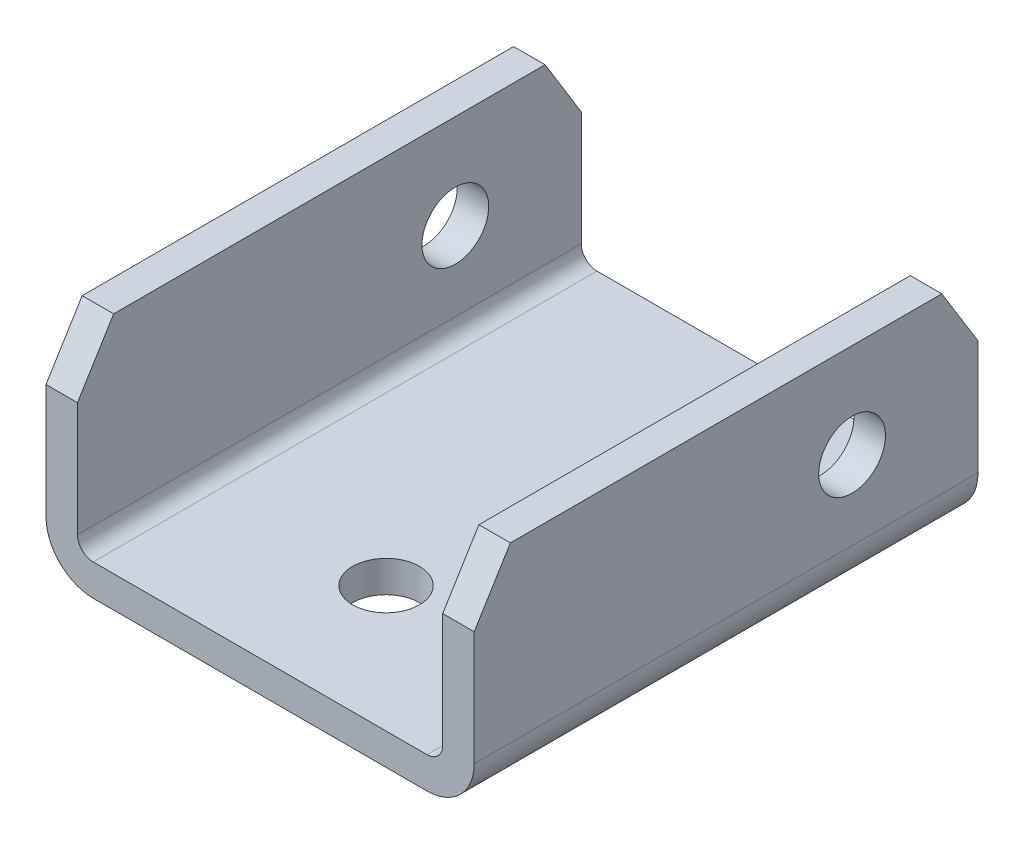
ISO-10303-21;
HEADER;
FILE_DESCRIPTION(('STEP AP214'),'2;1');
FILE_NAME('part.step','',(''),(''),'','','');
FILE_SCHEMA(('AUTOMOTIVE_DESIGN { 1 0 10303 214 1 1 1 1 }'));
ENDSEC;
DATA;
#1=APPLICATION_CONTEXT('core data for automotive mechanical design processes');
#2=APPLICATION_PROTOCOL_DEFINITION('international standard','automotive_design',2000,#1);
#3=PRODUCT_CONTEXT('',#1,'mechanical');
#4=PRODUCT('Part','Part','',(#3));
#5=PRODUCT_RELATED_PRODUCT_CATEGORY('part','',(#4));
#6=PRODUCT_DEFINITION_FORMATION('','',#4);
#7=PRODUCT_DEFINITION_CONTEXT('part definition',#1,'design');
#8=PRODUCT_DEFINITION('design','',#6,#7);
#9=PRODUCT_DEFINITION_SHAPE('','',#8);
#10=(LENGTH_UNIT() NAMED_UNIT(*) SI_UNIT(.MILLI.,.METRE.));
#11=(NAMED_UNIT(*) PLANE_ANGLE_UNIT() SI_UNIT($,.RADIAN.));
#12=(NAMED_UNIT(*) SI_UNIT($,.STERADIAN.) SOLID_ANGLE_UNIT());
#13=UNCERTAINTY_MEASURE_WITH_UNIT(LENGTH_MEASURE(1.E-05),#10,'distance_accuracy_value','');
#14=(GEOMETRIC_REPRESENTATION_CONTEXT(3) GLOBAL_UNCERTAINTY_ASSIGNED_CONTEXT((#13)) GLOBAL_UNIT_ASSIGNED_CONTEXT((#10,
#11,#12)) REPRESENTATION_CONTEXT('',''));
#15=CARTESIAN_POINT('',(0.,0.,0.));
#16=DIRECTION('',(0.,0.,1.));
#17=DIRECTION('',(1.,0.,0.));
#18=AXIS2_PLACEMENT_3D('',#15,#16,#17);
#19=CARTESIAN_POINT('',(-18.415,0.,25.4));
#20=DIRECTION('',(-1.,0.,0.));
#21=DIRECTION('',(0.,0.,1.));
#22=AXIS2_PLACEMENT_3D('',#19,#20,#21);
#23=PLANE('',#22);
#24=DIRECTION('',(0.,-0.851962880519693,-0.523602186986062));
#25=VECTOR('',#24,1.);
#26=CARTESIAN_POINT('',(-18.415,23.6457625813702,-13.0744611493481));
#27=LINE('',#26,#25);
#28=CARTESIAN_POINT('',(-18.415,3.59064851929258,-25.4));
#29=VERTEX_POINT('',#28);
#30=CARTESIAN_POINT('',(-18.415,9.525,-21.7528464858152));
#31=VERTEX_POINT('',#30);
#32=EDGE_CURVE('E244',#29,#31,#27,.F.);
#33=ORIENTED_EDGE('',*,*,#32,.T.);
#34=DIRECTION('',(0.,0.,1.));
#35=VECTOR('',#34,1.);
#36=CARTESIAN_POINT('',(-18.415,9.525,25.4));
#37=LINE('',#36,#35);
#38=CARTESIAN_POINT('',(-18.415,9.525,21.7528464858152));
#39=VERTEX_POINT('',#38);
#40=EDGE_CURVE('E246',#39,#31,#37,.F.);
#41=ORIENTED_EDGE('',*,*,#40,.F.);
#42=DIRECTION('',(0.,-0.851962880519693,0.523602186986062));
#43=VECTOR('',#42,1.);
#44=CARTESIAN_POINT('',(-18.415,0.984409505840551,27.0017510603507));
#45=LINE('',#44,#43);
#46=CARTESIAN_POINT('',(-18.415,3.59064851929258,25.4));
#47=VERTEX_POINT('',#46);
#48=EDGE_CURVE('E127',#47,#39,#45,.F.);
#49=ORIENTED_EDGE('',*,*,#48,.F.);
#50=DIRECTION('',(0.,1.,0.));
#51=VECTOR('',#50,1.);
#52=CARTESIAN_POINT('',(-18.415,0.,25.4));
#53=LINE('',#52,#51);
#54=CARTESIAN_POINT('',(-18.415,-7.9375,25.4));
#55=VERTEX_POINT('',#54);
#56=EDGE_CURVE('E86',#55,#47,#53,.T.);
#57=ORIENTED_EDGE('',*,*,#56,.F.);
#58=DIRECTION('',(0.,0.,1.));
#59=VECTOR('',#58,1.);
#60=CARTESIAN_POINT('',(-18.415,-7.9375,25.4));
#61=LINE('',#60,#59);
#62=CARTESIAN_POINT('',(-18.415,-7.9375,-25.4));
#63=VERTEX_POINT('',#62);
#64=EDGE_CURVE('E187',#55,#63,#61,.F.);
#65=ORIENTED_EDGE('',*,*,#64,.T.);
#66=DIRECTION('',(0.,1.,0.));
#67=VECTOR('',#66,1.);
#68=CARTESIAN_POINT('',(-18.415,0.,-25.4));
#69=LINE('',#68,#67);
#70=EDGE_CURVE('E197',#63,#29,#69,.T.);
#71=ORIENTED_EDGE('',*,*,#70,.T.);
#72=EDGE_LOOP('',(#33,#41,#49,#57,#65,#71));
#73=FACE_BOUND('',#72,.T.);
#74=CARTESIAN_POINT('',(-18.415,0.,-12.7));
#75=DIRECTION('',(-1.,0.,0.));
#76=DIRECTION('',(0.,0.,1.));
#77=AXIS2_PLACEMENT_3D('',#74,#75,#76);
#78=CIRCLE('',#77,3.3655);
#79=CARTESIAN_POINT('',(-18.415,0.,-9.3345));
#80=VERTEX_POINT('',#79);
#81=EDGE_CURVE('E20',#80,#80,#78,.T.);
#82=ORIENTED_EDGE('',*,*,#81,.T.);
#83=EDGE_LOOP('',(#82));
#84=FACE_BOUND('',#83,.T.);
#85=ADVANCED_FACE('F17',(#73,#84),#23,.F.);
#86=CARTESIAN_POINT('',(18.415,0.,25.4));
#87=DIRECTION('',(-1.,0.,0.));
#88=DIRECTION('',(0.,0.,1.));
#89=AXIS2_PLACEMENT_3D('',#86,#87,#88);
#90=PLANE('',#89);
#91=CARTESIAN_POINT('',(18.415,0.,-12.7));
#92=DIRECTION('',(-1.,0.,0.));
#93=DIRECTION('',(0.,0.,1.));
#94=AXIS2_PLACEMENT_3D('',#91,#92,#93);
#95=CIRCLE('',#94,3.3655);
#96=CARTESIAN_POINT('',(18.415,0.,-9.3345));
#97=VERTEX_POINT('',#96);
#98=EDGE_CURVE('E224',#97,#97,#95,.F.);
#99=ORIENTED_EDGE('',*,*,#98,.T.);
#100=EDGE_LOOP('',(#99));
#101=FACE_BOUND('',#100,.T.);
#102=DIRECTION('',(0.,-0.851962880519693,0.523602186986062));
#103=VECTOR('',#102,1.);
#104=CARTESIAN_POINT('',(18.415,0.984409505840551,27.0017510603507));
#105=LINE('',#104,#103);
#106=CARTESIAN_POINT('',(18.415,9.52499999999999,21.7528464858152));
#107=VERTEX_POINT('',#106);
#108=CARTESIAN_POINT('',(18.415,3.59064851929258,25.4));
#109=VERTEX_POINT('',#108);
#110=EDGE_CURVE('E161',#107,#109,#105,.T.);
#111=ORIENTED_EDGE('',*,*,#110,.F.);
#112=DIRECTION('',(0.,0.,1.));
#113=VECTOR('',#112,1.);
#114=CARTESIAN_POINT('',(18.415,9.525,25.4));
#115=LINE('',#114,#113);
#116=CARTESIAN_POINT('',(18.415,9.525,-21.7528464858152));
#117=VERTEX_POINT('',#116);
#118=EDGE_CURVE('E219',#117,#107,#115,.T.);
#119=ORIENTED_EDGE('',*,*,#118,.F.);
#120=DIRECTION('',(0.,-0.851962880519693,-0.523602186986062));
#121=VECTOR('',#120,1.);
#122=CARTESIAN_POINT('',(18.415,23.6457625813702,-13.0744611493481));
#123=LINE('',#122,#121);
#124=CARTESIAN_POINT('',(18.415,3.59064851929258,-25.4));
#125=VERTEX_POINT('',#124);
#126=EDGE_CURVE('E97',#117,#125,#123,.T.);
#127=ORIENTED_EDGE('',*,*,#126,.T.);
#128=DIRECTION('',(0.,1.,0.));
#129=VECTOR('',#128,1.);
#130=CARTESIAN_POINT('',(18.415,0.,-25.4));
#131=LINE('',#130,#129);
#132=CARTESIAN_POINT('',(18.415,-7.9375,-25.4));
#133=VERTEX_POINT('',#132);
#134=EDGE_CURVE('E186',#125,#133,#131,.F.);
#135=ORIENTED_EDGE('',*,*,#134,.T.);
#136=DIRECTION('',(0.,0.,-1.));
#137=VECTOR('',#136,1.);
#138=CARTESIAN_POINT('',(18.415,-7.9375,25.4));
#139=LINE('',#138,#137);
#140=CARTESIAN_POINT('',(18.415,-7.9375,25.4));
#141=VERTEX_POINT('',#140);
#142=EDGE_CURVE('E184',#133,#141,#139,.F.);
#143=ORIENTED_EDGE('',*,*,#142,.T.);
#144=DIRECTION('',(0.,1.,0.));
#145=VECTOR('',#144,1.);
#146=CARTESIAN_POINT('',(18.415,0.,25.4));
#147=LINE('',#146,#145);
#148=EDGE_CURVE('E162',#109,#141,#147,.F.);
#149=ORIENTED_EDGE('',*,*,#148,.F.);
#150=EDGE_LOOP('',(#111,#119,#127,#135,#143,#149));
#151=FACE_BOUND('',#150,.T.);
#152=ADVANCED_FACE('F301',(#101,#151),#90,.T.);
#153=CARTESIAN_POINT('',(-18.415,0.,-12.7));
#154=DIRECTION('',(-1.,0.,0.));
#155=DIRECTION('',(0.,0.,1.));
#156=AXIS2_PLACEMENT_3D('',#153,#154,#155);
#157=CYLINDRICAL_SURFACE('',#156,3.3655);
#158=CARTESIAN_POINT('',(-21.59,0.,-12.7));
#159=DIRECTION('',(-1.,0.,0.));
#160=DIRECTION('',(0.,0.,1.));
#161=AXIS2_PLACEMENT_3D('',#158,#159,#160);
#162=CIRCLE('',#161,3.3655);
#163=CARTESIAN_POINT('',(-21.59,0.,-9.3345));
#164=VERTEX_POINT('',#163);
#165=EDGE_CURVE('E146',#164,#164,#162,.F.);
#166=ORIENTED_EDGE('',*,*,#165,.F.);
#167=EDGE_LOOP('',(#166));
#168=FACE_BOUND('',#167,.T.);
#169=ORIENTED_EDGE('',*,*,#81,.F.);
#170=EDGE_LOOP('',(#169));
#171=FACE_BOUND('',#170,.T.);
#172=ADVANCED_FACE('F434',(#168,#171),#157,.F.);
#173=CARTESIAN_POINT('',(-18.415,0.984409505840551,27.0017510603507));
#174=DIRECTION('',(0.,0.523602186986062,0.851962880519693));
#175=DIRECTION('',(0.,-0.851962880519693,0.523602186986062));
#176=AXIS2_PLACEMENT_3D('',#173,#174,#175);
#177=PLANE('',#176);
#178=DIRECTION('',(1.,0.,0.));
#179=VECTOR('',#178,1.);
#180=CARTESIAN_POINT('',(-18.415,3.59064851929258,25.4));
#181=LINE('',#180,#179);
#182=CARTESIAN_POINT('',(-21.59,3.59064851929258,25.4));
#183=VERTEX_POINT('',#182);
#184=EDGE_CURVE('E119',#183,#47,#181,.T.);
#185=ORIENTED_EDGE('',*,*,#184,.T.);
#186=ORIENTED_EDGE('',*,*,#48,.T.);
#187=DIRECTION('',(1.,0.,0.));
#188=VECTOR('',#187,1.);
#189=CARTESIAN_POINT('',(-18.415,9.525,21.7528464858152));
#190=LINE('',#189,#188);
#191=CARTESIAN_POINT('',(-21.59,9.525,21.7528464858152));
#192=VERTEX_POINT('',#191);
#193=EDGE_CURVE('E133',#192,#39,#190,.T.);
#194=ORIENTED_EDGE('',*,*,#193,.F.);
#195=DIRECTION('',(0.,0.851962880519693,-0.523602186986062));
#196=VECTOR('',#195,1.);
#197=CARTESIAN_POINT('',(-21.59,3.59064851929258,25.4));
#198=LINE('',#197,#196);
#199=EDGE_CURVE('E130',#183,#192,#198,.T.);
#200=ORIENTED_EDGE('',*,*,#199,.F.);
#201=EDGE_LOOP('',(#185,#186,#194,#200));
#202=FACE_BOUND('',#201,.T.);
#203=ADVANCED_FACE('F131',(#202),#177,.T.);
#204=CARTESIAN_POINT('',(-18.415,9.525,25.4));
#205=DIRECTION('',(0.,1.,0.));
#206=DIRECTION('',(0.,0.,1.));
#207=AXIS2_PLACEMENT_3D('',#204,#205,#206);
#208=PLANE('',#207);
#209=ORIENTED_EDGE('',*,*,#193,.T.);
#210=ORIENTED_EDGE('',*,*,#40,.T.);
#211=DIRECTION('',(1.,0.,0.));
#212=VECTOR('',#211,1.);
#213=CARTESIAN_POINT('',(-18.415,9.525,-21.7528464858152));
#214=LINE('',#213,#212);
#215=CARTESIAN_POINT('',(-21.59,9.525,-21.7528464858152));
#216=VERTEX_POINT('',#215);
#217=EDGE_CURVE('E199',#31,#216,#214,.F.);
#218=ORIENTED_EDGE('',*,*,#217,.T.);
#219=DIRECTION('',(0.,0.,1.));
#220=VECTOR('',#219,1.);
#221=CARTESIAN_POINT('',(-21.59,9.525,25.4));
#222=LINE('',#221,#220);
#223=EDGE_CURVE('E137',#192,#216,#222,.F.);
#224=ORIENTED_EDGE('',*,*,#223,.F.);
#225=EDGE_LOOP('',(#209,#210,#218,#224));
#226=FACE_BOUND('',#225,.T.);
#227=ADVANCED_FACE('F427',(#226),#208,.T.);
#228=CARTESIAN_POINT('',(-18.415,23.6457625813702,-13.0744611493481));
#229=DIRECTION('',(0.,-0.523602186986062,0.851962880519693));
#230=DIRECTION('',(0.,-0.851962880519693,-0.523602186986062));
#231=AXIS2_PLACEMENT_3D('',#228,#229,#230);
#232=PLANE('',#231);
#233=DIRECTION('',(0.,-0.851962880519693,-0.523602186986062));
#234=VECTOR('',#233,1.);
#235=CARTESIAN_POINT('',(-21.59,9.525,-21.7528464858152));
#236=LINE('',#235,#234);
#237=CARTESIAN_POINT('',(-21.59,3.59064851929259,-25.4));
#238=VERTEX_POINT('',#237);
#239=EDGE_CURVE('E209',#216,#238,#236,.T.);
#240=ORIENTED_EDGE('',*,*,#239,.F.);
#241=ORIENTED_EDGE('',*,*,#217,.F.);
#242=ORIENTED_EDGE('',*,*,#32,.F.);
#243=DIRECTION('',(1.,0.,0.));
#244=VECTOR('',#243,1.);
#245=CARTESIAN_POINT('',(-18.415,3.59064851929258,-25.4));
#246=LINE('',#245,#244);
#247=EDGE_CURVE('E196',#29,#238,#246,.F.);
#248=ORIENTED_EDGE('',*,*,#247,.T.);
#249=EDGE_LOOP('',(#240,#241,#242,#248));
#250=FACE_BOUND('',#249,.T.);
#251=ADVANCED_FACE('F420',(#250),#232,.F.);
#252=CARTESIAN_POINT('',(-16.8275,-7.9375,25.4));
#253=DIRECTION('',(0.,0.,1.));
#254=DIRECTION('',(1.,0.,0.));
#255=AXIS2_PLACEMENT_3D('',#252,#253,#254);
#256=CYLINDRICAL_SURFACE('',#255,1.5875);
#257=DIRECTION('',(0.,0.,1.));
#258=VECTOR('',#257,1.);
#259=CARTESIAN_POINT('',(-16.8275,-9.525,25.4));
#260=LINE('',#259,#258);
#261=CARTESIAN_POINT('',(-16.8275,-9.525,25.4));
#262=VERTEX_POINT('',#261);
#263=CARTESIAN_POINT('',(-16.8275,-9.525,-25.4));
#264=VERTEX_POINT('',#263);
#265=EDGE_CURVE('E212',#262,#264,#260,.F.);
#266=ORIENTED_EDGE('',*,*,#265,.T.);
#267=CARTESIAN_POINT('',(-16.8275,-7.9375,-25.4));
#268=DIRECTION('',(0.,0.,1.));
#269=DIRECTION('',(1.,0.,0.));
#270=AXIS2_PLACEMENT_3D('',#267,#268,#269);
#271=CIRCLE('',#270,1.5875);
#272=EDGE_CURVE('E290',#63,#264,#271,.T.);
#273=ORIENTED_EDGE('',*,*,#272,.F.);
#274=ORIENTED_EDGE('',*,*,#64,.F.);
#275=CARTESIAN_POINT('',(-16.8275,-7.9375,25.4));
#276=DIRECTION('',(0.,0.,1.));
#277=DIRECTION('',(1.,0.,0.));
#278=AXIS2_PLACEMENT_3D('',#275,#276,#277);
#279=CIRCLE('',#278,1.5875);
#280=EDGE_CURVE('E296',#55,#262,#279,.T.);
#281=ORIENTED_EDGE('',*,*,#280,.T.);
#282=EDGE_LOOP('',(#266,#273,#274,#281));
#283=FACE_BOUND('',#282,.T.);
#284=ADVANCED_FACE('F413',(#283),#256,.F.);
#285=CARTESIAN_POINT('',(16.8275,-7.9375,25.4));
#286=DIRECTION('',(0.,0.,-1.));
#287=DIRECTION('',(-1.,0.,0.));
#288=AXIS2_PLACEMENT_3D('',#285,#286,#287);
#289=CYLINDRICAL_SURFACE('',#288,1.5875);
#290=ORIENTED_EDGE('',*,*,#142,.F.);
#291=CARTESIAN_POINT('',(16.8275,-7.9375,-25.4));
#292=DIRECTION('',(0.,0.,-1.));
#293=DIRECTION('',(-1.,0.,0.));
#294=AXIS2_PLACEMENT_3D('',#291,#292,#293);
#295=CIRCLE('',#294,1.5875);
#296=CARTESIAN_POINT('',(16.8275,-9.525,-25.4));
#297=VERTEX_POINT('',#296);
#298=EDGE_CURVE('E283',#297,#133,#295,.F.);
#299=ORIENTED_EDGE('',*,*,#298,.F.);
#300=DIRECTION('',(0.,0.,1.));
#301=VECTOR('',#300,1.);
#302=CARTESIAN_POINT('',(16.8275,-9.525,25.4));
#303=LINE('',#302,#301);
#304=CARTESIAN_POINT('',(16.8275,-9.525,25.4));
#305=VERTEX_POINT('',#304);
#306=EDGE_CURVE('E293',#297,#305,#303,.T.);
#307=ORIENTED_EDGE('',*,*,#306,.T.);
#308=CARTESIAN_POINT('',(16.8275,-7.9375,25.4));
#309=DIRECTION('',(0.,0.,-1.));
#310=DIRECTION('',(-1.,0.,0.));
#311=AXIS2_PLACEMENT_3D('',#308,#309,#310);
#312=CIRCLE('',#311,1.5875);
#313=EDGE_CURVE('E287',#305,#141,#312,.F.);
#314=ORIENTED_EDGE('',*,*,#313,.T.);
#315=EDGE_LOOP('',(#290,#299,#307,#314));
#316=FACE_BOUND('',#315,.T.);
#317=ADVANCED_FACE('F411',(#316),#289,.F.);
#318=CARTESIAN_POINT('',(18.415,0.984409505840551,27.0017510603507));
#319=DIRECTION('',(0.,0.523602186986062,0.851962880519693));
#320=DIRECTION('',(0.,-0.851962880519693,0.523602186986062));
#321=AXIS2_PLACEMENT_3D('',#318,#319,#320);
#322=PLANE('',#321);
#323=DIRECTION('',(1.,0.,0.));
#324=VECTOR('',#323,1.);
#325=CARTESIAN_POINT('',(18.415,9.525,21.7528464858152));
#326=LINE('',#325,#324);
#327=CARTESIAN_POINT('',(21.59,9.52499999999999,21.7528464858152));
#328=VERTEX_POINT('',#327);
#329=EDGE_CURVE('E229',#107,#328,#326,.T.);
#330=ORIENTED_EDGE('',*,*,#329,.F.);
#331=ORIENTED_EDGE('',*,*,#110,.T.);
#332=DIRECTION('',(1.,0.,0.));
#333=VECTOR('',#332,1.);
#334=CARTESIAN_POINT('',(18.415,3.59064851929258,25.4));
#335=LINE('',#334,#333);
#336=CARTESIAN_POINT('',(21.59,3.59064851929258,25.4));
#337=VERTEX_POINT('',#336);
#338=EDGE_CURVE('E158',#109,#337,#335,.T.);
#339=ORIENTED_EDGE('',*,*,#338,.T.);
#340=DIRECTION('',(0.,0.851962880519693,-0.523602186986062));
#341=VECTOR('',#340,1.);
#342=CARTESIAN_POINT('',(21.59,3.59064851929258,25.4));
#343=LINE('',#342,#341);
#344=EDGE_CURVE('E165',#337,#328,#343,.T.);
#345=ORIENTED_EDGE('',*,*,#344,.T.);
#346=EDGE_LOOP('',(#330,#331,#339,#345));
#347=FACE_BOUND('',#346,.T.);
#348=ADVANCED_FACE('F395',(#347),#322,.T.);
#349=CARTESIAN_POINT('',(18.415,9.525,25.4));
#350=DIRECTION('',(0.,1.,0.));
#351=DIRECTION('',(0.,0.,1.));
#352=AXIS2_PLACEMENT_3D('',#349,#350,#351);
#353=PLANE('',#352);
#354=DIRECTION('',(1.,0.,0.));
#355=VECTOR('',#354,1.);
#356=CARTESIAN_POINT('',(18.415,9.525,-21.7528464858152));
#357=LINE('',#356,#355);
#358=CARTESIAN_POINT('',(21.59,9.525,-21.7528464858152));
#359=VERTEX_POINT('',#358);
#360=EDGE_CURVE('E181',#359,#117,#357,.F.);
#361=ORIENTED_EDGE('',*,*,#360,.T.);
#362=ORIENTED_EDGE('',*,*,#118,.T.);
#363=ORIENTED_EDGE('',*,*,#329,.T.);
#364=DIRECTION('',(0.,0.,1.));
#365=VECTOR('',#364,1.);
#366=CARTESIAN_POINT('',(21.59,9.525,25.4));
#367=LINE('',#366,#365);
#368=EDGE_CURVE('E168',#328,#359,#367,.F.);
#369=ORIENTED_EDGE('',*,*,#368,.T.);
#370=EDGE_LOOP('',(#361,#362,#363,#369));
#371=FACE_BOUND('',#370,.T.);
#372=ADVANCED_FACE('F315',(#371),#353,.T.);
#373=CARTESIAN_POINT('',(18.415,23.6457625813702,-13.0744611493481));
#374=DIRECTION('',(0.,-0.523602186986062,0.851962880519693));
#375=DIRECTION('',(0.,-0.851962880519693,-0.523602186986062));
#376=AXIS2_PLACEMENT_3D('',#373,#374,#375);
#377=PLANE('',#376);
#378=DIRECTION('',(0.,-0.851962880519693,-0.523602186986062));
#379=VECTOR('',#378,1.);
#380=CARTESIAN_POINT('',(21.59,9.525,-21.7528464858152));
#381=LINE('',#380,#379);
#382=CARTESIAN_POINT('',(21.59,3.59064851929259,-25.4));
#383=VERTEX_POINT('',#382);
#384=EDGE_CURVE('E172',#359,#383,#381,.T.);
#385=ORIENTED_EDGE('',*,*,#384,.T.);
#386=DIRECTION('',(1.,0.,0.));
#387=VECTOR('',#386,1.);
#388=CARTESIAN_POINT('',(18.415,3.59064851929258,-25.4));
#389=LINE('',#388,#387);
#390=EDGE_CURVE('E178',#125,#383,#389,.T.);
#391=ORIENTED_EDGE('',*,*,#390,.F.);
#392=ORIENTED_EDGE('',*,*,#126,.F.);
#393=ORIENTED_EDGE('',*,*,#360,.F.);
#394=EDGE_LOOP('',(#385,#391,#392,#393));
#395=FACE_BOUND('',#394,.T.);
#396=ADVANCED_FACE('F305',(#395),#377,.F.);
#397=CARTESIAN_POINT('',(18.415,0.,-12.7));
#398=DIRECTION('',(-1.,0.,0.));
#399=DIRECTION('',(0.,0.,1.));
#400=AXIS2_PLACEMENT_3D('',#397,#398,#399);
#401=CYLINDRICAL_SURFACE('',#400,3.3655);
#402=CARTESIAN_POINT('',(21.59,0.,-12.7));
#403=DIRECTION('',(-1.,0.,0.));
#404=DIRECTION('',(0.,0.,1.));
#405=AXIS2_PLACEMENT_3D('',#402,#403,#404);
#406=CIRCLE('',#405,3.3655);
#407=CARTESIAN_POINT('',(21.59,0.,-9.3345));
#408=VERTEX_POINT('',#407);
#409=EDGE_CURVE('E175',#408,#408,#406,.F.);
#410=ORIENTED_EDGE('',*,*,#409,.T.);
#411=EDGE_LOOP('',(#410));
#412=FACE_BOUND('',#411,.T.);
#413=ORIENTED_EDGE('',*,*,#98,.F.);
#414=EDGE_LOOP('',(#413));
#415=FACE_BOUND('',#414,.T.);
#416=ADVANCED_FACE('F303',(#412,#415),#401,.F.);
#417=CARTESIAN_POINT('',(-21.59,0.,25.4));
#418=DIRECTION('',(-1.,0.,0.));
#419=DIRECTION('',(0.,0.,1.));
#420=AXIS2_PLACEMENT_3D('',#417,#418,#419);
#421=PLANE('',#420);
#422=ORIENTED_EDGE('',*,*,#223,.T.);
#423=ORIENTED_EDGE('',*,*,#239,.T.);
#424=DIRECTION('',(0.,1.,0.));
#425=VECTOR('',#424,1.);
#426=CARTESIAN_POINT('',(-21.59,0.,-25.4));
#427=LINE('',#426,#425);
#428=CARTESIAN_POINT('',(-21.59,-7.9375,-25.4));
#429=VERTEX_POINT('',#428);
#430=EDGE_CURVE('E144',#238,#429,#427,.F.);
#431=ORIENTED_EDGE('',*,*,#430,.T.);
#432=DIRECTION('',(0.,0.,1.));
#433=VECTOR('',#432,1.);
#434=CARTESIAN_POINT('',(-21.59,-7.9375,25.4));
#435=LINE('',#434,#433);
#436=CARTESIAN_POINT('',(-21.59,-7.9375,25.4));
#437=VERTEX_POINT('',#436);
#438=EDGE_CURVE('E142',#437,#429,#435,.F.);
#439=ORIENTED_EDGE('',*,*,#438,.F.);
#440=DIRECTION('',(0.,1.,0.));
#441=VECTOR('',#440,1.);
#442=CARTESIAN_POINT('',(-21.59,0.,25.4));
#443=LINE('',#442,#441);
#444=EDGE_CURVE('E123',#437,#183,#443,.T.);
#445=ORIENTED_EDGE('',*,*,#444,.T.);
#446=ORIENTED_EDGE('',*,*,#199,.T.);
#447=EDGE_LOOP('',(#422,#423,#431,#439,#445,#446));
#448=FACE_BOUND('',#447,.T.);
#449=ORIENTED_EDGE('',*,*,#165,.T.);
#450=EDGE_LOOP('',(#449));
#451=FACE_BOUND('',#450,.T.);
#452=ADVANCED_FACE('F139',(#448,#451),#421,.T.);
#453=CARTESIAN_POINT('',(0.,-9.525,25.4));
#454=DIRECTION('',(0.,-1.,0.));
#455=DIRECTION('',(1.,0.,0.));
#456=AXIS2_PLACEMENT_3D('',#453,#454,#455);
#457=PLANE('',#456);
#458=ORIENTED_EDGE('',*,*,#306,.F.);
#459=DIRECTION('',(1.,0.,0.));
#460=VECTOR('',#459,1.);
#461=CARTESIAN_POINT('',(0.,-9.525,-25.4));
#462=LINE('',#461,#460);
#463=EDGE_CURVE('E275',#297,#264,#462,.F.);
#464=ORIENTED_EDGE('',*,*,#463,.T.);
#465=ORIENTED_EDGE('',*,*,#265,.F.);
#466=DIRECTION('',(1.,0.,0.));
#467=VECTOR('',#466,1.);
#468=CARTESIAN_POINT('',(0.,-9.525,25.4));
#469=LINE('',#468,#467);
#470=EDGE_CURVE('E153',#305,#262,#469,.F.);
#471=ORIENTED_EDGE('',*,*,#470,.F.);
#472=EDGE_LOOP('',(#458,#464,#465,#471));
#473=FACE_BOUND('',#472,.T.);
#474=CARTESIAN_POINT('',(0.,-9.525,12.7));
#475=DIRECTION('',(0.,-1.,0.));
#476=DIRECTION('',(1.,0.,0.));
#477=AXIS2_PLACEMENT_3D('',#474,#475,#476);
#478=CIRCLE('',#477,3.3655);
#479=CARTESIAN_POINT('',(3.3655,-9.525,12.7));
#480=VERTEX_POINT('',#479);
#481=EDGE_CURVE('E157',#480,#480,#478,.T.);
#482=ORIENTED_EDGE('',*,*,#481,.T.);
#483=EDGE_LOOP('',(#482));
#484=FACE_BOUND('',#483,.T.);
#485=ADVANCED_FACE('F313',(#473,#484),#457,.F.);
#486=CARTESIAN_POINT('',(21.59,0.,25.4));
#487=DIRECTION('',(-1.,0.,0.));
#488=DIRECTION('',(0.,0.,1.));
#489=AXIS2_PLACEMENT_3D('',#486,#487,#488);
#490=PLANE('',#489);
#491=ORIENTED_EDGE('',*,*,#409,.F.);
#492=EDGE_LOOP('',(#491));
#493=FACE_BOUND('',#492,.T.);
#494=ORIENTED_EDGE('',*,*,#368,.F.);
#495=ORIENTED_EDGE('',*,*,#344,.F.);
#496=DIRECTION('',(0.,1.,0.));
#497=VECTOR('',#496,1.);
#498=CARTESIAN_POINT('',(21.59,0.,25.4));
#499=LINE('',#498,#497);
#500=CARTESIAN_POINT('',(21.59,-7.9375,25.4));
#501=VERTEX_POINT('',#500);
#502=EDGE_CURVE('E169',#501,#337,#499,.T.);
#503=ORIENTED_EDGE('',*,*,#502,.F.);
#504=DIRECTION('',(0.,0.,-1.));
#505=VECTOR('',#504,1.);
#506=CARTESIAN_POINT('',(21.59,-7.9375,25.4));
#507=LINE('',#506,#505);
#508=CARTESIAN_POINT('',(21.59,-7.9375,-25.4));
#509=VERTEX_POINT('',#508);
#510=EDGE_CURVE('E270',#509,#501,#507,.F.);
#511=ORIENTED_EDGE('',*,*,#510,.F.);
#512=DIRECTION('',(0.,1.,0.));
#513=VECTOR('',#512,1.);
#514=CARTESIAN_POINT('',(21.59,0.,-25.4));
#515=LINE('',#514,#513);
#516=EDGE_CURVE('E286',#383,#509,#515,.F.);
#517=ORIENTED_EDGE('',*,*,#516,.F.);
#518=ORIENTED_EDGE('',*,*,#384,.F.);
#519=EDGE_LOOP('',(#494,#495,#503,#511,#517,#518));
#520=FACE_BOUND('',#519,.T.);
#521=ADVANCED_FACE('F343',(#493,#520),#490,.F.);
#522=CARTESIAN_POINT('',(0.,-9.525,12.7));
#523=DIRECTION('',(0.,-1.,0.));
#524=DIRECTION('',(1.,0.,0.));
#525=AXIS2_PLACEMENT_3D('',#522,#523,#524);
#526=CYLINDRICAL_SURFACE('',#525,3.3655);
#527=ORIENTED_EDGE('',*,*,#481,.F.);
#528=EDGE_LOOP('',(#527));
#529=FACE_BOUND('',#528,.T.);
#530=CARTESIAN_POINT('',(0.,-12.7,12.7));
#531=DIRECTION('',(0.,-1.,0.));
#532=DIRECTION('',(1.,0.,0.));
#533=AXIS2_PLACEMENT_3D('',#530,#531,#532);
#534=CIRCLE('',#533,3.3655);
#535=CARTESIAN_POINT('',(3.36550000000001,-12.7,12.7));
#536=VERTEX_POINT('',#535);
#537=EDGE_CURVE('E266',#536,#536,#534,.F.);
#538=ORIENTED_EDGE('',*,*,#537,.F.);
#539=EDGE_LOOP('',(#538));
#540=FACE_BOUND('',#539,.T.);
#541=ADVANCED_FACE('F340',(#529,#540),#526,.F.);
#542=CARTESIAN_POINT('',(0.,-9.525,25.4));
#543=DIRECTION('',(0.,0.,1.));
#544=DIRECTION('',(1.,0.,0.));
#545=AXIS2_PLACEMENT_3D('',#542,#543,#544);
#546=PLANE('',#545);
#547=DIRECTION('',(1.,0.,0.));
#548=VECTOR('',#547,1.);
#549=CARTESIAN_POINT('',(0.,-12.7,25.4));
#550=LINE('',#549,#548);
#551=CARTESIAN_POINT('',(16.8275,-12.7,25.4));
#552=VERTEX_POINT('',#551);
#553=CARTESIAN_POINT('',(-16.8275,-12.7,25.4));
#554=VERTEX_POINT('',#553);
#555=EDGE_CURVE('E269',#552,#554,#550,.F.);
#556=ORIENTED_EDGE('',*,*,#555,.F.);
#557=CARTESIAN_POINT('',(16.8275,-7.9375,25.4));
#558=DIRECTION('',(0.,0.,-1.));
#559=DIRECTION('',(-1.,0.,0.));
#560=AXIS2_PLACEMENT_3D('',#557,#558,#559);
#561=CIRCLE('',#560,4.7625);
#562=EDGE_CURVE('E272',#501,#552,#561,.T.);
#563=ORIENTED_EDGE('',*,*,#562,.F.);
#564=ORIENTED_EDGE('',*,*,#502,.T.);
#565=ORIENTED_EDGE('',*,*,#338,.F.);
#566=ORIENTED_EDGE('',*,*,#148,.T.);
#567=ORIENTED_EDGE('',*,*,#313,.F.);
#568=ORIENTED_EDGE('',*,*,#470,.T.);
#569=ORIENTED_EDGE('',*,*,#280,.F.);
#570=ORIENTED_EDGE('',*,*,#56,.T.);
#571=ORIENTED_EDGE('',*,*,#184,.F.);
#572=ORIENTED_EDGE('',*,*,#444,.F.);
#573=CARTESIAN_POINT('',(-16.8275,-7.9375,25.4));
#574=DIRECTION('',(0.,0.,1.));
#575=DIRECTION('',(1.,0.,0.));
#576=AXIS2_PLACEMENT_3D('',#573,#574,#575);
#577=CIRCLE('',#576,4.7625);
#578=EDGE_CURVE('E156',#554,#437,#577,.F.);
#579=ORIENTED_EDGE('',*,*,#578,.F.);
#580=EDGE_LOOP('',(#556,#563,#564,#565,#566,#567,#568,#569,#570,#571,#572,#579));
#581=FACE_BOUND('',#580,.T.);
#582=ADVANCED_FACE('F121',(#581),#546,.T.);
#583=CARTESIAN_POINT('',(-16.8275,-7.9375,25.4));
#584=DIRECTION('',(0.,0.,1.));
#585=DIRECTION('',(1.,0.,0.));
#586=AXIS2_PLACEMENT_3D('',#583,#584,#585);
#587=CYLINDRICAL_SURFACE('',#586,4.7625);
#588=CARTESIAN_POINT('',(-16.8275,-7.9375,-25.4));
#589=DIRECTION('',(0.,0.,1.));
#590=DIRECTION('',(1.,0.,0.));
#591=AXIS2_PLACEMENT_3D('',#588,#589,#590);
#592=CIRCLE('',#591,4.7625);
#593=CARTESIAN_POINT('',(-16.8275,-12.7,-25.4));
#594=VERTEX_POINT('',#593);
#595=EDGE_CURVE('E276',#429,#594,#592,.T.);
#596=ORIENTED_EDGE('',*,*,#595,.T.);
#597=DIRECTION('',(0.,0.,1.));
#598=VECTOR('',#597,1.);
#599=CARTESIAN_POINT('',(-16.8275,-12.7,25.4));
#600=LINE('',#599,#598);
#601=EDGE_CURVE('E370',#554,#594,#600,.F.);
#602=ORIENTED_EDGE('',*,*,#601,.F.);
#603=ORIENTED_EDGE('',*,*,#578,.T.);
#604=ORIENTED_EDGE('',*,*,#438,.T.);
#605=EDGE_LOOP('',(#596,#602,#603,#604));
#606=FACE_BOUND('',#605,.T.);
#607=ADVANCED_FACE('F334',(#606),#587,.T.);
#608=CARTESIAN_POINT('',(0.,-9.525,-25.4));
#609=DIRECTION('',(0.,0.,1.));
#610=DIRECTION('',(1.,0.,0.));
#611=AXIS2_PLACEMENT_3D('',#608,#609,#610);
#612=PLANE('',#611);
#613=DIRECTION('',(1.,0.,0.));
#614=VECTOR('',#613,1.);
#615=CARTESIAN_POINT('',(0.,-12.7,-25.4));
#616=LINE('',#615,#614);
#617=CARTESIAN_POINT('',(16.8275,-12.7,-25.4));
#618=VERTEX_POINT('',#617);
#619=EDGE_CURVE('E26',#594,#618,#616,.T.);
#620=ORIENTED_EDGE('',*,*,#619,.F.);
#621=ORIENTED_EDGE('',*,*,#595,.F.);
#622=ORIENTED_EDGE('',*,*,#430,.F.);
#623=ORIENTED_EDGE('',*,*,#247,.F.);
#624=ORIENTED_EDGE('',*,*,#70,.F.);
#625=ORIENTED_EDGE('',*,*,#272,.T.);
#626=ORIENTED_EDGE('',*,*,#463,.F.);
#627=ORIENTED_EDGE('',*,*,#298,.T.);
#628=ORIENTED_EDGE('',*,*,#134,.F.);
#629=ORIENTED_EDGE('',*,*,#390,.T.);
#630=ORIENTED_EDGE('',*,*,#516,.T.);
#631=CARTESIAN_POINT('',(16.8275,-7.9375,-25.4));
#632=DIRECTION('',(0.,0.,-1.));
#633=DIRECTION('',(-1.,0.,0.));
#634=AXIS2_PLACEMENT_3D('',#631,#632,#633);
#635=CIRCLE('',#634,4.7625);
#636=EDGE_CURVE('E35',#618,#509,#635,.F.);
#637=ORIENTED_EDGE('',*,*,#636,.F.);
#638=EDGE_LOOP('',(#620,#621,#622,#623,#624,#625,#626,#627,#628,#629,#630,#637));
#639=FACE_BOUND('',#638,.T.);
#640=ADVANCED_FACE('F326',(#639),#612,.F.);
#641=CARTESIAN_POINT('',(16.8275,-7.9375,25.4));
#642=DIRECTION('',(0.,0.,-1.));
#643=DIRECTION('',(-1.,0.,0.));
#644=AXIS2_PLACEMENT_3D('',#641,#642,#643);
#645=CYLINDRICAL_SURFACE('',#644,4.7625);
#646=ORIENTED_EDGE('',*,*,#636,.T.);
#647=ORIENTED_EDGE('',*,*,#510,.T.);
#648=ORIENTED_EDGE('',*,*,#562,.T.);
#649=DIRECTION('',(0.,0.,1.));
#650=VECTOR('',#649,1.);
#651=CARTESIAN_POINT('',(16.8275,-12.7,25.4));
#652=LINE('',#651,#650);
#653=EDGE_CURVE('E11',#618,#552,#652,.T.);
#654=ORIENTED_EDGE('',*,*,#653,.F.);
#655=EDGE_LOOP('',(#646,#647,#648,#654));
#656=FACE_BOUND('',#655,.T.);
#657=ADVANCED_FACE('F320',(#656),#645,.T.);
#658=CARTESIAN_POINT('',(0.,-12.7,25.4));
#659=DIRECTION('',(0.,-1.,0.));
#660=DIRECTION('',(1.,0.,0.));
#661=AXIS2_PLACEMENT_3D('',#658,#659,#660);
#662=PLANE('',#661);
#663=ORIENTED_EDGE('',*,*,#619,.T.);
#664=ORIENTED_EDGE('',*,*,#653,.T.);
#665=ORIENTED_EDGE('',*,*,#555,.T.);
#666=ORIENTED_EDGE('',*,*,#601,.T.);
#667=EDGE_LOOP('',(#663,#664,#665,#666));
#668=FACE_BOUND('',#667,.T.);
#669=ORIENTED_EDGE('',*,*,#537,.T.);
#670=EDGE_LOOP('',(#669));
#671=FACE_BOUND('',#670,.T.);
#672=ADVANCED_FACE('F318',(#668,#671),#662,.T.);
#673=CLOSED_SHELL('',(#85,#152,#172,#203,#227,#251,#284,#317,#348,#372,#396,#416,#452,#485,#521,
#541,#582,#607,#640,#657,#672));
#674=MANIFOLD_SOLID_BREP('B1',#673);
#675=ADVANCED_BREP_SHAPE_REPRESENTATION('',(#18,#674),#14);
#676=SHAPE_DEFINITION_REPRESENTATION(#9,#675);
ENDSEC;
END-ISO-10303-21;
